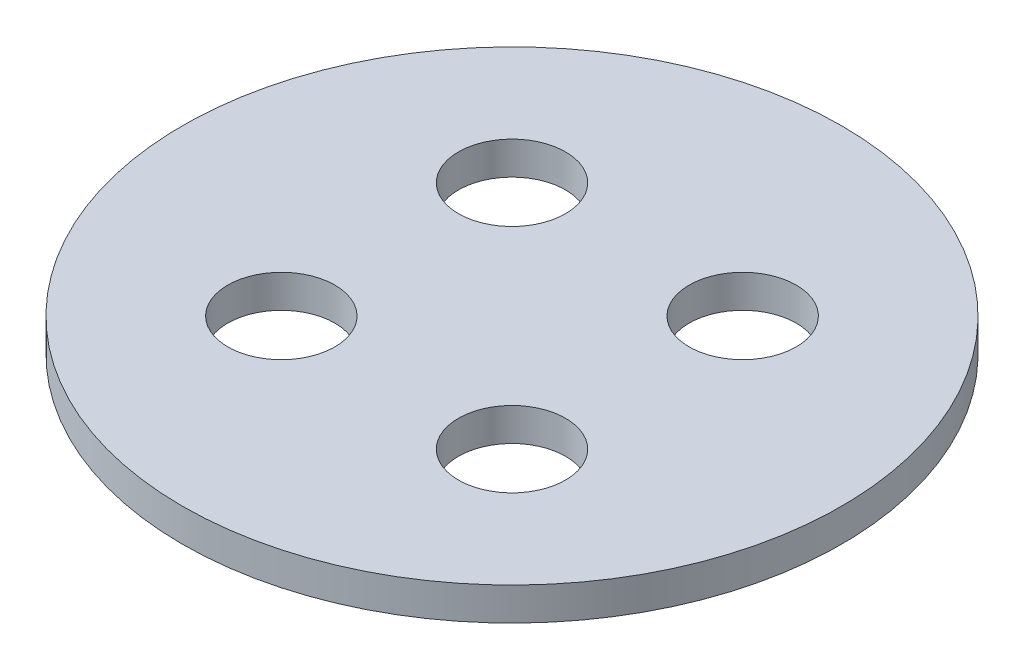
ISO-10303-21;
HEADER;
FILE_DESCRIPTION(('STEP AP214'),'2;1');
FILE_NAME('part.step','',(''),(''),'','','');
FILE_SCHEMA(('AUTOMOTIVE_DESIGN { 1 0 10303 214 1 1 1 1 }'));
ENDSEC;
DATA;
#1=APPLICATION_CONTEXT('core data for automotive mechanical design processes');
#2=APPLICATION_PROTOCOL_DEFINITION('international standard','automotive_design',2000,#1);
#3=PRODUCT_CONTEXT('',#1,'mechanical');
#4=PRODUCT('Part','Part','',(#3));
#5=PRODUCT_RELATED_PRODUCT_CATEGORY('part','',(#4));
#6=PRODUCT_DEFINITION_FORMATION('','',#4);
#7=PRODUCT_DEFINITION_CONTEXT('part definition',#1,'design');
#8=PRODUCT_DEFINITION('design','',#6,#7);
#9=PRODUCT_DEFINITION_SHAPE('','',#8);
#10=(LENGTH_UNIT() NAMED_UNIT(*) SI_UNIT(.MILLI.,.METRE.));
#11=(NAMED_UNIT(*) PLANE_ANGLE_UNIT() SI_UNIT($,.RADIAN.));
#12=(NAMED_UNIT(*) SI_UNIT($,.STERADIAN.) SOLID_ANGLE_UNIT());
#13=UNCERTAINTY_MEASURE_WITH_UNIT(LENGTH_MEASURE(1.E-05),#10,'distance_accuracy_value','');
#14=(GEOMETRIC_REPRESENTATION_CONTEXT(3) GLOBAL_UNCERTAINTY_ASSIGNED_CONTEXT((#13)) GLOBAL_UNIT_ASSIGNED_CONTEXT((#10,
#11,#12)) REPRESENTATION_CONTEXT('',''));
#15=CARTESIAN_POINT('',(0.,0.,0.));
#16=DIRECTION('',(0.,0.,1.));
#17=DIRECTION('',(1.,0.,0.));
#18=AXIS2_PLACEMENT_3D('',#15,#16,#17);
#19=CARTESIAN_POINT('',(0.,2.,0.));
#20=DIRECTION('',(0.,1.,0.));
#21=DIRECTION('',(0.,0.,1.));
#22=AXIS2_PLACEMENT_3D('',#19,#20,#21);
#23=PLANE('',#22);
#24=CARTESIAN_POINT('',(7.,2.,7.));
#25=DIRECTION('',(0.,1.,0.));
#26=DIRECTION('',(0.,0.,1.));
#27=AXIS2_PLACEMENT_3D('',#24,#25,#26);
#28=CIRCLE('',#27,3.25);
#29=CARTESIAN_POINT('',(7.,2.,10.25));
#30=VERTEX_POINT('',#29);
#31=EDGE_CURVE('E58',#30,#30,#28,.T.);
#32=ORIENTED_EDGE('',*,*,#31,.F.);
#33=EDGE_LOOP('',(#32));
#34=FACE_BOUND('',#33,.T.);
#35=CARTESIAN_POINT('',(-7.,2.,-7.));
#36=DIRECTION('',(0.,1.,0.));
#37=DIRECTION('',(0.,0.,1.));
#38=AXIS2_PLACEMENT_3D('',#35,#36,#37);
#39=CIRCLE('',#38,3.25);
#40=CARTESIAN_POINT('',(-7.,2.,-3.75));
#41=VERTEX_POINT('',#40);
#42=EDGE_CURVE('E47',#41,#41,#39,.T.);
#43=ORIENTED_EDGE('',*,*,#42,.F.);
#44=EDGE_LOOP('',(#43));
#45=FACE_BOUND('',#44,.T.);
#46=CARTESIAN_POINT('',(0.,2.,0.));
#47=DIRECTION('',(0.,1.,0.));
#48=DIRECTION('',(0.,0.,1.));
#49=AXIS2_PLACEMENT_3D('',#46,#47,#48);
#50=CIRCLE('',#49,20.);
#51=CARTESIAN_POINT('',(0.,2.,20.));
#52=VERTEX_POINT('',#51);
#53=EDGE_CURVE('E10',#52,#52,#50,.T.);
#54=ORIENTED_EDGE('',*,*,#53,.T.);
#55=EDGE_LOOP('',(#54));
#56=FACE_BOUND('',#55,.T.);
#57=CARTESIAN_POINT('',(7.,2.,-7.));
#58=DIRECTION('',(0.,1.,0.));
#59=DIRECTION('',(0.,0.,-1.));
#60=AXIS2_PLACEMENT_3D('',#57,#58,#59);
#61=CIRCLE('',#60,3.25);
#62=CARTESIAN_POINT('',(7.,2.,-10.25));
#63=VERTEX_POINT('',#62);
#64=EDGE_CURVE('E52',#63,#63,#61,.T.);
#65=ORIENTED_EDGE('',*,*,#64,.F.);
#66=EDGE_LOOP('',(#65));
#67=FACE_BOUND('',#66,.T.);
#68=CARTESIAN_POINT('',(-7.,2.,7.));
#69=DIRECTION('',(0.,1.,0.));
#70=DIRECTION('',(0.,0.,-1.));
#71=AXIS2_PLACEMENT_3D('',#68,#69,#70);
#72=CIRCLE('',#71,3.25);
#73=CARTESIAN_POINT('',(-7.,2.,3.75));
#74=VERTEX_POINT('',#73);
#75=EDGE_CURVE('E64',#74,#74,#72,.T.);
#76=ORIENTED_EDGE('',*,*,#75,.F.);
#77=EDGE_LOOP('',(#76));
#78=FACE_BOUND('',#77,.T.);
#79=ADVANCED_FACE('F36',(#34,#45,#56,#67,#78),#23,.T.);
#80=CARTESIAN_POINT('',(0.,0.,0.));
#81=DIRECTION('',(0.,1.,0.));
#82=DIRECTION('',(0.,0.,1.));
#83=AXIS2_PLACEMENT_3D('',#80,#81,#82);
#84=PLANE('',#83);
#85=CARTESIAN_POINT('',(0.,0.,0.));
#86=DIRECTION('',(0.,1.,0.));
#87=DIRECTION('',(0.,0.,1.));
#88=AXIS2_PLACEMENT_3D('',#85,#86,#87);
#89=CIRCLE('',#88,20.);
#90=CARTESIAN_POINT('',(0.,0.,20.));
#91=VERTEX_POINT('',#90);
#92=EDGE_CURVE('E40',#91,#91,#89,.T.);
#93=ORIENTED_EDGE('',*,*,#92,.F.);
#94=EDGE_LOOP('',(#93));
#95=FACE_BOUND('',#94,.T.);
#96=CARTESIAN_POINT('',(-7.,0.,-7.));
#97=DIRECTION('',(0.,1.,0.));
#98=DIRECTION('',(0.,0.,1.));
#99=AXIS2_PLACEMENT_3D('',#96,#97,#98);
#100=CIRCLE('',#99,3.25);
#101=CARTESIAN_POINT('',(-7.,0.,-3.75));
#102=VERTEX_POINT('',#101);
#103=EDGE_CURVE('E49',#102,#102,#100,.T.);
#104=ORIENTED_EDGE('',*,*,#103,.T.);
#105=EDGE_LOOP('',(#104));
#106=FACE_BOUND('',#105,.T.);
#107=CARTESIAN_POINT('',(7.,0.,-7.));
#108=DIRECTION('',(0.,1.,0.));
#109=DIRECTION('',(0.,0.,-1.));
#110=AXIS2_PLACEMENT_3D('',#107,#108,#109);
#111=CIRCLE('',#110,3.25);
#112=CARTESIAN_POINT('',(7.,0.,-10.25));
#113=VERTEX_POINT('',#112);
#114=EDGE_CURVE('E55',#113,#113,#111,.T.);
#115=ORIENTED_EDGE('',*,*,#114,.T.);
#116=EDGE_LOOP('',(#115));
#117=FACE_BOUND('',#116,.T.);
#118=CARTESIAN_POINT('',(7.,0.,7.));
#119=DIRECTION('',(0.,1.,0.));
#120=DIRECTION('',(0.,0.,1.));
#121=AXIS2_PLACEMENT_3D('',#118,#119,#120);
#122=CIRCLE('',#121,3.25);
#123=CARTESIAN_POINT('',(7.,0.,10.25));
#124=VERTEX_POINT('',#123);
#125=EDGE_CURVE('E61',#124,#124,#122,.T.);
#126=ORIENTED_EDGE('',*,*,#125,.T.);
#127=EDGE_LOOP('',(#126));
#128=FACE_BOUND('',#127,.T.);
#129=CARTESIAN_POINT('',(-7.,0.,7.));
#130=DIRECTION('',(0.,1.,0.));
#131=DIRECTION('',(0.,0.,-1.));
#132=AXIS2_PLACEMENT_3D('',#129,#130,#131);
#133=CIRCLE('',#132,3.25);
#134=CARTESIAN_POINT('',(-7.,0.,3.75));
#135=VERTEX_POINT('',#134);
#136=EDGE_CURVE('E67',#135,#135,#133,.T.);
#137=ORIENTED_EDGE('',*,*,#136,.T.);
#138=EDGE_LOOP('',(#137));
#139=FACE_BOUND('',#138,.T.);
#140=ADVANCED_FACE('F77',(#95,#106,#117,#128,#139),#84,.F.);
#141=CARTESIAN_POINT('',(0.,2.,0.));
#142=DIRECTION('',(0.,-1.,0.));
#143=DIRECTION('',(0.,0.,-1.));
#144=AXIS2_PLACEMENT_3D('',#141,#142,#143);
#145=CYLINDRICAL_SURFACE('',#144,20.);
#146=ORIENTED_EDGE('',*,*,#53,.F.);
#147=EDGE_LOOP('',(#146));
#148=FACE_BOUND('',#147,.T.);
#149=ORIENTED_EDGE('',*,*,#92,.T.);
#150=EDGE_LOOP('',(#149));
#151=FACE_BOUND('',#150,.T.);
#152=ADVANCED_FACE('F38',(#148,#151),#145,.T.);
#153=CARTESIAN_POINT('',(-7.,2.,-7.));
#154=DIRECTION('',(0.,-1.,0.));
#155=DIRECTION('',(0.,0.,-1.));
#156=AXIS2_PLACEMENT_3D('',#153,#154,#155);
#157=CYLINDRICAL_SURFACE('',#156,3.25);
#158=ORIENTED_EDGE('',*,*,#42,.T.);
#159=EDGE_LOOP('',(#158));
#160=FACE_BOUND('',#159,.T.);
#161=ORIENTED_EDGE('',*,*,#103,.F.);
#162=EDGE_LOOP('',(#161));
#163=FACE_BOUND('',#162,.T.);
#164=ADVANCED_FACE('F87',(#160,#163),#157,.F.);
#165=CARTESIAN_POINT('',(7.,2.,-7.));
#166=DIRECTION('',(0.,-1.,0.));
#167=DIRECTION('',(0.,0.,-1.));
#168=AXIS2_PLACEMENT_3D('',#165,#166,#167);
#169=CYLINDRICAL_SURFACE('',#168,3.25);
#170=ORIENTED_EDGE('',*,*,#64,.T.);
#171=EDGE_LOOP('',(#170));
#172=FACE_BOUND('',#171,.T.);
#173=ORIENTED_EDGE('',*,*,#114,.F.);
#174=EDGE_LOOP('',(#173));
#175=FACE_BOUND('',#174,.T.);
#176=ADVANCED_FACE('F90',(#172,#175),#169,.F.);
#177=CARTESIAN_POINT('',(7.,2.,7.));
#178=DIRECTION('',(0.,-1.,0.));
#179=DIRECTION('',(0.,0.,-1.));
#180=AXIS2_PLACEMENT_3D('',#177,#178,#179);
#181=CYLINDRICAL_SURFACE('',#180,3.25);
#182=ORIENTED_EDGE('',*,*,#31,.T.);
#183=EDGE_LOOP('',(#182));
#184=FACE_BOUND('',#183,.T.);
#185=ORIENTED_EDGE('',*,*,#125,.F.);
#186=EDGE_LOOP('',(#185));
#187=FACE_BOUND('',#186,.T.);
#188=ADVANCED_FACE('F94',(#184,#187),#181,.F.);
#189=CARTESIAN_POINT('',(-7.,2.,7.));
#190=DIRECTION('',(0.,-1.,0.));
#191=DIRECTION('',(0.,0.,-1.));
#192=AXIS2_PLACEMENT_3D('',#189,#190,#191);
#193=CYLINDRICAL_SURFACE('',#192,3.25);
#194=ORIENTED_EDGE('',*,*,#75,.T.);
#195=EDGE_LOOP('',(#194));
#196=FACE_BOUND('',#195,.T.);
#197=ORIENTED_EDGE('',*,*,#136,.F.);
#198=EDGE_LOOP('',(#197));
#199=FACE_BOUND('',#198,.T.);
#200=ADVANCED_FACE('F73',(#196,#199),#193,.F.);
#201=CLOSED_SHELL('',(#79,#140,#152,#164,#176,#188,#200));
#202=MANIFOLD_SOLID_BREP('B2',#201);
#203=ADVANCED_BREP_SHAPE_REPRESENTATION('',(#18,#202),#14);
#204=SHAPE_DEFINITION_REPRESENTATION(#9,#203);
ENDSEC;
END-ISO-10303-21;
